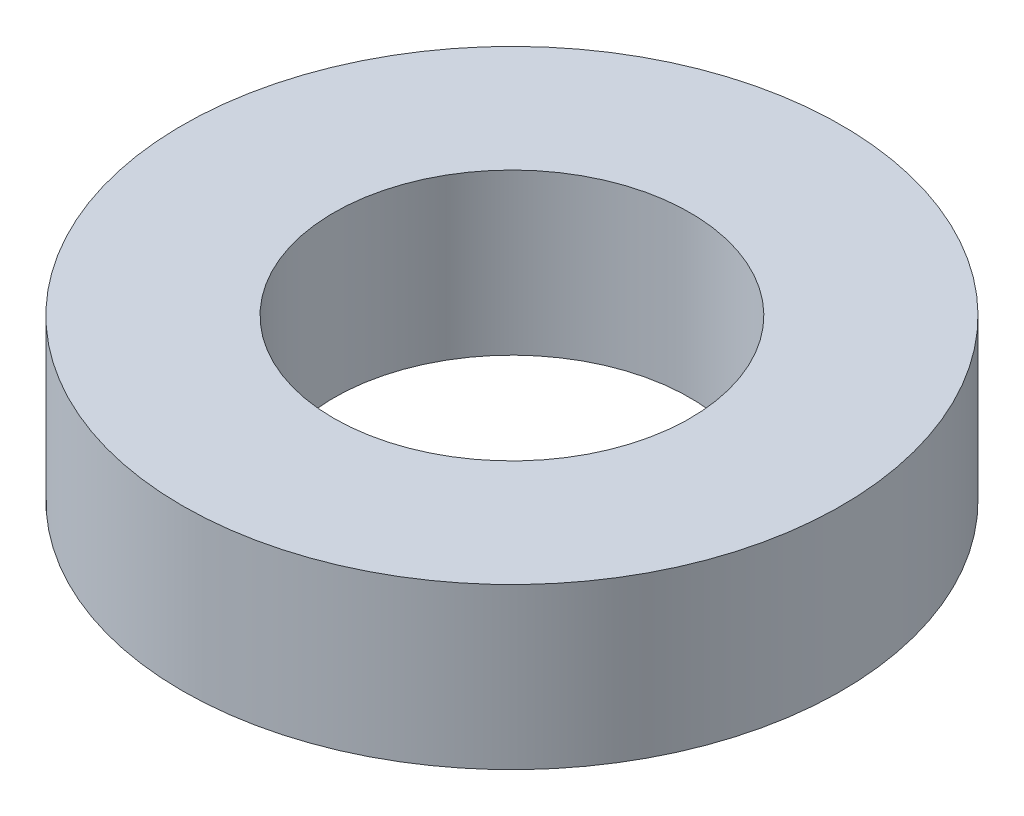
ISO-10303-21;
HEADER;
FILE_DESCRIPTION(('STEP AP214'),'2;1');
FILE_NAME('part.step','',(''),(''),'','','');
FILE_SCHEMA(('AUTOMOTIVE_DESIGN { 1 0 10303 214 1 1 1 1 }'));
ENDSEC;
DATA;
#1=APPLICATION_CONTEXT('core data for automotive mechanical design processes');
#2=APPLICATION_PROTOCOL_DEFINITION('international standard','automotive_design',2000,#1);
#3=PRODUCT_CONTEXT('',#1,'mechanical');
#4=PRODUCT('Part','Part','',(#3));
#5=PRODUCT_RELATED_PRODUCT_CATEGORY('part','',(#4));
#6=PRODUCT_DEFINITION_FORMATION('','',#4);
#7=PRODUCT_DEFINITION_CONTEXT('part definition',#1,'design');
#8=PRODUCT_DEFINITION('design','',#6,#7);
#9=PRODUCT_DEFINITION_SHAPE('','',#8);
#10=(LENGTH_UNIT() NAMED_UNIT(*) SI_UNIT(.MILLI.,.METRE.));
#11=(NAMED_UNIT(*) PLANE_ANGLE_UNIT() SI_UNIT($,.RADIAN.));
#12=(NAMED_UNIT(*) SI_UNIT($,.STERADIAN.) SOLID_ANGLE_UNIT());
#13=UNCERTAINTY_MEASURE_WITH_UNIT(LENGTH_MEASURE(1.E-05),#10,'distance_accuracy_value','');
#14=(GEOMETRIC_REPRESENTATION_CONTEXT(3) GLOBAL_UNCERTAINTY_ASSIGNED_CONTEXT((#13)) GLOBAL_UNIT_ASSIGNED_CONTEXT((#10,
#11,#12)) REPRESENTATION_CONTEXT('',''));
#15=CARTESIAN_POINT('',(0.,0.,0.));
#16=DIRECTION('',(0.,0.,1.));
#17=DIRECTION('',(1.,0.,0.));
#18=AXIS2_PLACEMENT_3D('',#15,#16,#17);
#19=CARTESIAN_POINT('',(0.,9.,0.));
#20=DIRECTION('',(0.,-1.,0.));
#21=DIRECTION('',(0.,0.,-1.));
#22=AXIS2_PLACEMENT_3D('',#19,#20,#21);
#23=CYLINDRICAL_SURFACE('',#22,18.5);
#24=CARTESIAN_POINT('',(0.,9.,0.));
#25=DIRECTION('',(0.,1.,0.));
#26=DIRECTION('',(0.,0.,1.));
#27=AXIS2_PLACEMENT_3D('',#24,#25,#26);
#28=CIRCLE('',#27,18.5);
#29=CARTESIAN_POINT('',(0.,9.,18.5));
#30=VERTEX_POINT('',#29);
#31=EDGE_CURVE('E10',#30,#30,#28,.T.);
#32=ORIENTED_EDGE('',*,*,#31,.F.);
#33=EDGE_LOOP('',(#32));
#34=FACE_BOUND('',#33,.T.);
#35=CARTESIAN_POINT('',(0.,0.,0.));
#36=DIRECTION('',(0.,1.,0.));
#37=DIRECTION('',(0.,0.,1.));
#38=AXIS2_PLACEMENT_3D('',#35,#36,#37);
#39=CIRCLE('',#38,18.5);
#40=CARTESIAN_POINT('',(0.,0.,18.5));
#41=VERTEX_POINT('',#40);
#42=EDGE_CURVE('E34',#41,#41,#39,.T.);
#43=ORIENTED_EDGE('',*,*,#42,.T.);
#44=EDGE_LOOP('',(#43));
#45=FACE_BOUND('',#44,.T.);
#46=ADVANCED_FACE('F31',(#34,#45),#23,.T.);
#47=CARTESIAN_POINT('',(0.,9.,0.));
#48=DIRECTION('',(0.,1.,0.));
#49=DIRECTION('',(0.,0.,1.));
#50=AXIS2_PLACEMENT_3D('',#47,#48,#49);
#51=PLANE('',#50);
#52=CARTESIAN_POINT('',(0.,9.,0.));
#53=DIRECTION('',(0.,1.,0.));
#54=DIRECTION('',(0.,0.,1.));
#55=AXIS2_PLACEMENT_3D('',#52,#53,#54);
#56=CIRCLE('',#55,10.);
#57=CARTESIAN_POINT('',(0.,9.,10.));
#58=VERTEX_POINT('',#57);
#59=EDGE_CURVE('E43',#58,#58,#56,.T.);
#60=ORIENTED_EDGE('',*,*,#59,.F.);
#61=EDGE_LOOP('',(#60));
#62=FACE_BOUND('',#61,.T.);
#63=ORIENTED_EDGE('',*,*,#31,.T.);
#64=EDGE_LOOP('',(#63));
#65=FACE_BOUND('',#64,.T.);
#66=ADVANCED_FACE('F58',(#62,#65),#51,.T.);
#67=CARTESIAN_POINT('',(0.,0.,0.));
#68=DIRECTION('',(0.,1.,0.));
#69=DIRECTION('',(0.,0.,1.));
#70=AXIS2_PLACEMENT_3D('',#67,#68,#69);
#71=PLANE('',#70);
#72=CARTESIAN_POINT('',(0.,0.,0.));
#73=DIRECTION('',(0.,1.,0.));
#74=DIRECTION('',(0.,0.,1.));
#75=AXIS2_PLACEMENT_3D('',#72,#73,#74);
#76=CIRCLE('',#75,10.);
#77=CARTESIAN_POINT('',(0.,0.,10.));
#78=VERTEX_POINT('',#77);
#79=EDGE_CURVE('E41',#78,#78,#76,.T.);
#80=ORIENTED_EDGE('',*,*,#79,.T.);
#81=EDGE_LOOP('',(#80));
#82=FACE_BOUND('',#81,.T.);
#83=ORIENTED_EDGE('',*,*,#42,.F.);
#84=EDGE_LOOP('',(#83));
#85=FACE_BOUND('',#84,.T.);
#86=ADVANCED_FACE('F49',(#82,#85),#71,.F.);
#87=CARTESIAN_POINT('',(0.,0.,0.));
#88=DIRECTION('',(0.,1.,0.));
#89=DIRECTION('',(0.,0.,1.));
#90=AXIS2_PLACEMENT_3D('',#87,#88,#89);
#91=CYLINDRICAL_SURFACE('',#90,10.);
#92=ORIENTED_EDGE('',*,*,#79,.F.);
#93=EDGE_LOOP('',(#92));
#94=FACE_BOUND('',#93,.T.);
#95=ORIENTED_EDGE('',*,*,#59,.T.);
#96=EDGE_LOOP('',(#95));
#97=FACE_BOUND('',#96,.T.);
#98=ADVANCED_FACE('F52',(#94,#97),#91,.F.);
#99=CLOSED_SHELL('',(#46,#66,#86,#98));
#100=MANIFOLD_SOLID_BREP('B2',#99);
#101=ADVANCED_BREP_SHAPE_REPRESENTATION('',(#18,#100),#14);
#102=SHAPE_DEFINITION_REPRESENTATION(#9,#101);
ENDSEC;
END-ISO-10303-21;
